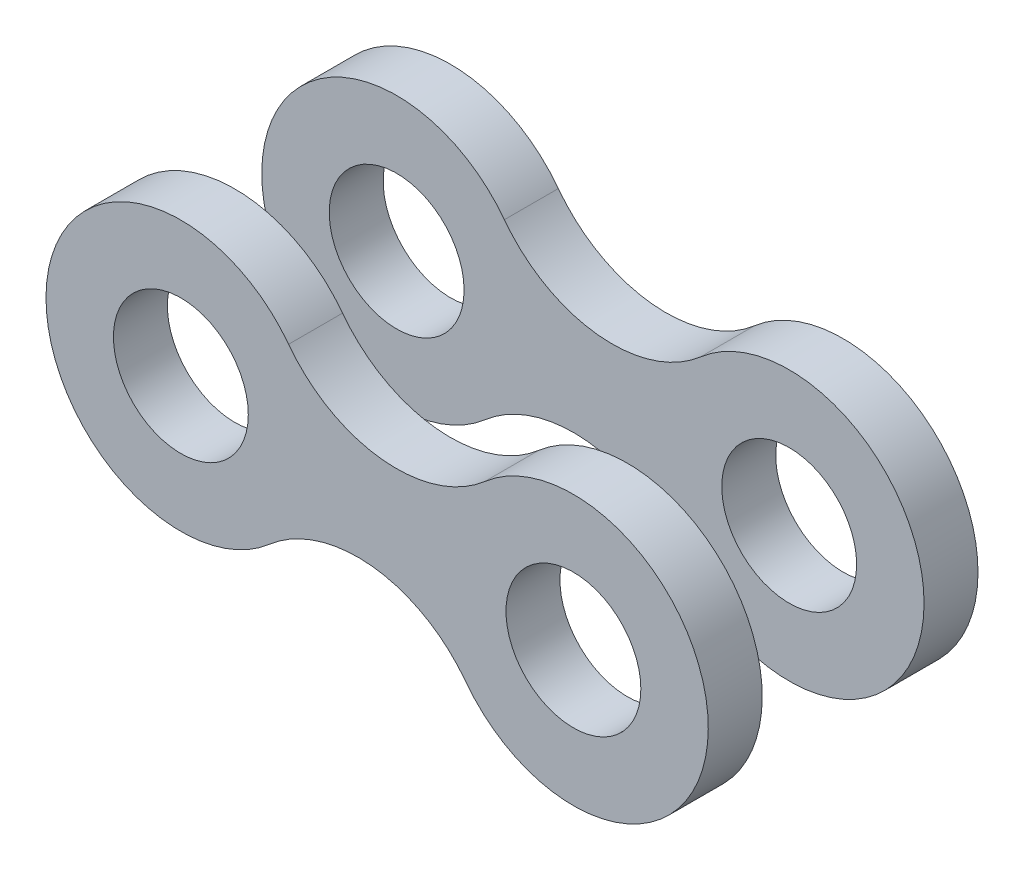
ISO-10303-21;
HEADER;
FILE_DESCRIPTION(('STEP AP214'),'2;1');
FILE_NAME('part.step','',(''),(''),'','','');
FILE_SCHEMA(('AUTOMOTIVE_DESIGN { 1 0 10303 214 1 1 1 1 }'));
ENDSEC;
DATA;
#1=APPLICATION_CONTEXT('core data for automotive mechanical design processes');
#2=APPLICATION_PROTOCOL_DEFINITION('international standard','automotive_design',2000,#1);
#3=PRODUCT_CONTEXT('',#1,'mechanical');
#4=PRODUCT('Part','Part','',(#3));
#5=PRODUCT_RELATED_PRODUCT_CATEGORY('part','',(#4));
#6=PRODUCT_DEFINITION_FORMATION('','',#4);
#7=PRODUCT_DEFINITION_CONTEXT('part definition',#1,'design');
#8=PRODUCT_DEFINITION('design','',#6,#7);
#9=PRODUCT_DEFINITION_SHAPE('','',#8);
#10=(LENGTH_UNIT() NAMED_UNIT(*) SI_UNIT(.MILLI.,.METRE.));
#11=(NAMED_UNIT(*) PLANE_ANGLE_UNIT() SI_UNIT($,.RADIAN.));
#12=(NAMED_UNIT(*) SI_UNIT($,.STERADIAN.) SOLID_ANGLE_UNIT());
#13=UNCERTAINTY_MEASURE_WITH_UNIT(LENGTH_MEASURE(1.E-05),#10,'distance_accuracy_value','');
#14=(GEOMETRIC_REPRESENTATION_CONTEXT(3) GLOBAL_UNCERTAINTY_ASSIGNED_CONTEXT((#13)) GLOBAL_UNIT_ASSIGNED_CONTEXT((#10,
#11,#12)) REPRESENTATION_CONTEXT('',''));
#15=CARTESIAN_POINT('',(0.,0.,0.));
#16=DIRECTION('',(0.,0.,1.));
#17=DIRECTION('',(1.,0.,0.));
#18=AXIS2_PLACEMENT_3D('',#15,#16,#17);
#19=CARTESIAN_POINT('',(7.98940405932851,76.0141019925456,-10.));
#20=DIRECTION('',(0.,0.,1.));
#21=DIRECTION('',(1.,0.,0.));
#22=AXIS2_PLACEMENT_3D('',#19,#20,#21);
#23=CYLINDRICAL_SURFACE('',#22,4.99999999999848);
#24=CARTESIAN_POINT('',(7.98940405932851,76.0141019925456,-8.));
#25=DIRECTION('',(0.,0.,-1.));
#26=DIRECTION('',(-1.,0.,0.));
#27=AXIS2_PLACEMENT_3D('',#24,#25,#26);
#28=CIRCLE('',#27,4.99999999999848);
#29=CARTESIAN_POINT('',(11.2716112082778,72.2422170219565,-8.));
#30=VERTEX_POINT('',#29);
#31=CARTESIAN_POINT('',(3.99470202966273,73.0070509962741,-8.));
#32=VERTEX_POINT('',#31);
#33=EDGE_CURVE('E116',#30,#32,#28,.T.);
#34=ORIENTED_EDGE('',*,*,#33,.F.);
#35=DIRECTION('',(0.,0.,1.));
#36=VECTOR('',#35,1.);
#37=CARTESIAN_POINT('',(11.2716112082778,72.2422170219565,-10.));
#38=LINE('',#37,#36);
#39=CARTESIAN_POINT('',(11.2716112082778,72.2422170219565,-10.));
#40=VERTEX_POINT('',#39);
#41=EDGE_CURVE('E12',#40,#30,#38,.T.);
#42=ORIENTED_EDGE('',*,*,#41,.F.);
#43=CARTESIAN_POINT('',(7.98940405932851,76.0141019925456,-10.));
#44=DIRECTION('',(0.,0.,-1.));
#45=DIRECTION('',(-1.,0.,0.));
#46=AXIS2_PLACEMENT_3D('',#43,#44,#45);
#47=CIRCLE('',#46,4.99999999999848);
#48=CARTESIAN_POINT('',(3.99470202966273,73.0070509962741,-10.));
#49=VERTEX_POINT('',#48);
#50=EDGE_CURVE('E109',#40,#49,#47,.T.);
#51=ORIENTED_EDGE('',*,*,#50,.T.);
#52=DIRECTION('',(0.,0.,1.));
#53=VECTOR('',#52,1.);
#54=CARTESIAN_POINT('',(3.99470202966273,73.0070509962741,-10.));
#55=LINE('',#54,#53);
#56=EDGE_CURVE('E54',#49,#32,#55,.T.);
#57=ORIENTED_EDGE('',*,*,#56,.T.);
#58=EDGE_LOOP('',(#34,#42,#51,#57));
#59=FACE_BOUND('',#58,.T.);
#60=ADVANCED_FACE('F51',(#59),#23,.F.);
#61=CARTESIAN_POINT('',(14.5538183572296,68.4703320513641,-10.));
#62=DIRECTION('',(0.,0.,1.));
#63=DIRECTION('',(1.,0.,0.));
#64=AXIS2_PLACEMENT_3D('',#61,#62,#63);
#65=CYLINDRICAL_SURFACE('',#64,5.00000000000123);
#66=CARTESIAN_POINT('',(14.5538183572296,68.4703320513641,-8.));
#67=DIRECTION('',(0.,0.,1.));
#68=DIRECTION('',(1.,0.,0.));
#69=AXIS2_PLACEMENT_3D('',#66,#67,#68);
#70=CIRCLE('',#69,5.00000000000123);
#71=CARTESIAN_POINT('',(10.5591163275639,65.4632810550894,-8.));
#72=VERTEX_POINT('',#71);
#73=EDGE_CURVE('E111',#72,#30,#70,.T.);
#74=ORIENTED_EDGE('',*,*,#73,.F.);
#75=DIRECTION('',(0.,0.,1.));
#76=VECTOR('',#75,1.);
#77=CARTESIAN_POINT('',(10.5591163275639,65.4632810550894,-10.));
#78=LINE('',#77,#76);
#79=CARTESIAN_POINT('',(10.5591163275639,65.4632810550894,-10.));
#80=VERTEX_POINT('',#79);
#81=EDGE_CURVE('E60',#80,#72,#78,.T.);
#82=ORIENTED_EDGE('',*,*,#81,.F.);
#83=CARTESIAN_POINT('',(14.5538183572296,68.4703320513641,-10.));
#84=DIRECTION('',(0.,0.,1.));
#85=DIRECTION('',(1.,0.,0.));
#86=AXIS2_PLACEMENT_3D('',#83,#84,#85);
#87=CIRCLE('',#86,5.00000000000123);
#88=EDGE_CURVE('E106',#80,#40,#87,.T.);
#89=ORIENTED_EDGE('',*,*,#88,.T.);
#90=ORIENTED_EDGE('',*,*,#41,.T.);
#91=EDGE_LOOP('',(#74,#82,#89,#90));
#92=FACE_BOUND('',#91,.T.);
#93=ADVANCED_FACE('F127',(#92),#65,.T.);
#94=CARTESIAN_POINT('',(6.56441429789912,62.4562300588154,-10.));
#95=DIRECTION('',(0.,0.,1.));
#96=DIRECTION('',(1.,0.,0.));
#97=AXIS2_PLACEMENT_3D('',#94,#95,#96);
#98=CYLINDRICAL_SURFACE('',#97,5.00000000000003);
#99=CARTESIAN_POINT('',(6.56441429789912,62.4562300588154,-8.));
#100=DIRECTION('',(0.,0.,-1.));
#101=DIRECTION('',(1.,0.,0.));
#102=AXIS2_PLACEMENT_3D('',#99,#100,#101);
#103=CIRCLE('',#102,5.00000000000003);
#104=CARTESIAN_POINT('',(3.28220714895012,66.2281150294088,-8.));
#105=VERTEX_POINT('',#104);
#106=EDGE_CURVE('E101',#105,#72,#103,.T.);
#107=ORIENTED_EDGE('',*,*,#106,.F.);
#108=DIRECTION('',(0.,0.,1.));
#109=VECTOR('',#108,1.);
#110=CARTESIAN_POINT('',(3.28220714895012,66.2281150294088,-10.));
#111=LINE('',#110,#109);
#112=CARTESIAN_POINT('',(3.28220714895012,66.2281150294088,-10.));
#113=VERTEX_POINT('',#112);
#114=EDGE_CURVE('E96',#113,#105,#111,.T.);
#115=ORIENTED_EDGE('',*,*,#114,.F.);
#116=CARTESIAN_POINT('',(6.56441429789912,62.4562300588154,-10.));
#117=DIRECTION('',(0.,0.,-1.));
#118=DIRECTION('',(1.,0.,0.));
#119=AXIS2_PLACEMENT_3D('',#116,#117,#118);
#120=CIRCLE('',#119,5.00000000000003);
#121=EDGE_CURVE('E99',#113,#80,#120,.T.);
#122=ORIENTED_EDGE('',*,*,#121,.T.);
#123=ORIENTED_EDGE('',*,*,#81,.T.);
#124=EDGE_LOOP('',(#107,#115,#122,#123));
#125=FACE_BOUND('',#124,.T.);
#126=ADVANCED_FACE('F98',(#125),#98,.F.);
#127=CARTESIAN_POINT('',(0.,70.,-10.));
#128=DIRECTION('',(0.,0.,1.));
#129=DIRECTION('',(1.,0.,0.));
#130=AXIS2_PLACEMENT_3D('',#127,#128,#129);
#131=CYLINDRICAL_SURFACE('',#130,4.99999999999843);
#132=CARTESIAN_POINT('',(0.,70.,-8.));
#133=DIRECTION('',(0.,0.,1.));
#134=DIRECTION('',(1.,0.,0.));
#135=AXIS2_PLACEMENT_3D('',#132,#133,#134);
#136=CIRCLE('',#135,4.99999999999843);
#137=EDGE_CURVE('E119',#32,#105,#136,.T.);
#138=ORIENTED_EDGE('',*,*,#137,.F.);
#139=ORIENTED_EDGE('',*,*,#56,.F.);
#140=CARTESIAN_POINT('',(0.,70.,-10.));
#141=DIRECTION('',(0.,0.,1.));
#142=DIRECTION('',(1.,0.,0.));
#143=AXIS2_PLACEMENT_3D('',#140,#141,#142);
#144=CIRCLE('',#143,4.99999999999843);
#145=EDGE_CURVE('E105',#49,#113,#144,.T.);
#146=ORIENTED_EDGE('',*,*,#145,.T.);
#147=ORIENTED_EDGE('',*,*,#114,.T.);
#148=EDGE_LOOP('',(#138,#139,#146,#147));
#149=FACE_BOUND('',#148,.T.);
#150=ADVANCED_FACE('F108',(#149),#131,.T.);
#151=CARTESIAN_POINT('',(3.99470202966425,73.0070509962728,-10.));
#152=DIRECTION('',(0.,0.,-1.));
#153=DIRECTION('',(-1.,0.,0.));
#154=AXIS2_PLACEMENT_3D('',#151,#152,#153);
#155=PLANE('',#154);
#156=CARTESIAN_POINT('',(14.5538183572296,68.4703320513641,-10.));
#157=DIRECTION('',(0.,0.,1.));
#158=DIRECTION('',(1.,0.,0.));
#159=AXIS2_PLACEMENT_3D('',#156,#157,#158);
#160=CIRCLE('',#159,2.50000000001364);
#161=CARTESIAN_POINT('',(17.0538183572433,68.4703320513641,-10.));
#162=VERTEX_POINT('',#161);
#163=EDGE_CURVE('E160',#162,#162,#160,.T.);
#164=ORIENTED_EDGE('',*,*,#163,.T.);
#165=EDGE_LOOP('',(#164));
#166=FACE_BOUND('',#165,.T.);
#167=CARTESIAN_POINT('',(0.,70.,-10.));
#168=DIRECTION('',(0.,0.,1.));
#169=DIRECTION('',(1.,0.,0.));
#170=AXIS2_PLACEMENT_3D('',#167,#168,#169);
#171=CIRCLE('',#170,2.50000000000001);
#172=CARTESIAN_POINT('',(2.50000000000001,70.,-10.));
#173=VERTEX_POINT('',#172);
#174=EDGE_CURVE('E120',#173,#173,#171,.T.);
#175=ORIENTED_EDGE('',*,*,#174,.T.);
#176=EDGE_LOOP('',(#175));
#177=FACE_BOUND('',#176,.T.);
#178=ORIENTED_EDGE('',*,*,#50,.F.);
#179=ORIENTED_EDGE('',*,*,#88,.F.);
#180=ORIENTED_EDGE('',*,*,#121,.F.);
#181=ORIENTED_EDGE('',*,*,#145,.F.);
#182=EDGE_LOOP('',(#178,#179,#180,#181));
#183=FACE_BOUND('',#182,.T.);
#184=ADVANCED_FACE('F104',(#166,#177,#183),#155,.T.);
#185=CARTESIAN_POINT('',(3.99470202966425,73.0070509962728,-8.));
#186=DIRECTION('',(0.,0.,-1.));
#187=DIRECTION('',(-1.,0.,0.));
#188=AXIS2_PLACEMENT_3D('',#185,#186,#187);
#189=PLANE('',#188);
#190=CARTESIAN_POINT('',(14.5538183572296,68.4703320513641,-8.));
#191=DIRECTION('',(0.,0.,1.));
#192=DIRECTION('',(1.,0.,0.));
#193=AXIS2_PLACEMENT_3D('',#190,#191,#192);
#194=CIRCLE('',#193,2.50000000001364);
#195=CARTESIAN_POINT('',(17.0538183572433,68.4703320513641,-8.));
#196=VERTEX_POINT('',#195);
#197=EDGE_CURVE('E163',#196,#196,#194,.T.);
#198=ORIENTED_EDGE('',*,*,#197,.F.);
#199=EDGE_LOOP('',(#198));
#200=FACE_BOUND('',#199,.T.);
#201=CARTESIAN_POINT('',(0.,70.,-8.));
#202=DIRECTION('',(0.,0.,1.));
#203=DIRECTION('',(1.,0.,0.));
#204=AXIS2_PLACEMENT_3D('',#201,#202,#203);
#205=CIRCLE('',#204,2.50000000000001);
#206=CARTESIAN_POINT('',(2.50000000000001,70.,-8.));
#207=VERTEX_POINT('',#206);
#208=EDGE_CURVE('E165',#207,#207,#205,.T.);
#209=ORIENTED_EDGE('',*,*,#208,.F.);
#210=EDGE_LOOP('',(#209));
#211=FACE_BOUND('',#210,.T.);
#212=ORIENTED_EDGE('',*,*,#33,.T.);
#213=ORIENTED_EDGE('',*,*,#137,.T.);
#214=ORIENTED_EDGE('',*,*,#106,.T.);
#215=ORIENTED_EDGE('',*,*,#73,.T.);
#216=EDGE_LOOP('',(#212,#213,#214,#215));
#217=FACE_BOUND('',#216,.T.);
#218=ADVANCED_FACE('F126',(#200,#211,#217),#189,.F.);
#219=CARTESIAN_POINT('',(0.,70.,-10.));
#220=DIRECTION('',(0.,0.,1.));
#221=DIRECTION('',(1.,0.,0.));
#222=AXIS2_PLACEMENT_3D('',#219,#220,#221);
#223=CYLINDRICAL_SURFACE('',#222,2.50000000000001);
#224=ORIENTED_EDGE('',*,*,#174,.F.);
#225=EDGE_LOOP('',(#224));
#226=FACE_BOUND('',#225,.T.);
#227=ORIENTED_EDGE('',*,*,#208,.T.);
#228=EDGE_LOOP('',(#227));
#229=FACE_BOUND('',#228,.T.);
#230=ADVANCED_FACE('F145',(#226,#229),#223,.F.);
#231=CARTESIAN_POINT('',(14.5538183572296,68.4703320513641,-10.));
#232=DIRECTION('',(0.,0.,1.));
#233=DIRECTION('',(1.,0.,0.));
#234=AXIS2_PLACEMENT_3D('',#231,#232,#233);
#235=CYLINDRICAL_SURFACE('',#234,2.50000000001364);
#236=ORIENTED_EDGE('',*,*,#163,.F.);
#237=EDGE_LOOP('',(#236));
#238=FACE_BOUND('',#237,.T.);
#239=ORIENTED_EDGE('',*,*,#197,.T.);
#240=EDGE_LOOP('',(#239));
#241=FACE_BOUND('',#240,.T.);
#242=ADVANCED_FACE('F152',(#238,#241),#235,.F.);
#243=CLOSED_SHELL('',(#60,#93,#126,#150,#184,#218,#230,#242));
#244=MANIFOLD_SOLID_BREP('B2',#243);
#245=CARTESIAN_POINT('',(7.98940405932851,76.0141019925456,-2.));
#246=DIRECTION('',(0.,0.,1.));
#247=DIRECTION('',(1.,0.,0.));
#248=AXIS2_PLACEMENT_3D('',#245,#246,#247);
#249=CYLINDRICAL_SURFACE('',#248,4.99999999999848);
#250=CARTESIAN_POINT('',(7.98940405932851,76.0141019925456,0.));
#251=DIRECTION('',(0.,0.,-1.));
#252=DIRECTION('',(-1.,0.,0.));
#253=AXIS2_PLACEMENT_3D('',#250,#251,#252);
#254=CIRCLE('',#253,4.99999999999848);
#255=CARTESIAN_POINT('',(11.2716112082778,72.2422170219565,0.));
#256=VERTEX_POINT('',#255);
#257=CARTESIAN_POINT('',(3.99470202966273,73.0070509962741,0.));
#258=VERTEX_POINT('',#257);
#259=EDGE_CURVE('E282',#256,#258,#254,.T.);
#260=ORIENTED_EDGE('',*,*,#259,.F.);
#261=DIRECTION('',(0.,0.,1.));
#262=VECTOR('',#261,1.);
#263=CARTESIAN_POINT('',(11.2716112082778,72.2422170219565,-2.));
#264=LINE('',#263,#262);
#265=CARTESIAN_POINT('',(11.2716112082778,72.2422170219565,-2.));
#266=VERTEX_POINT('',#265);
#267=EDGE_CURVE('E49',#266,#256,#264,.T.);
#268=ORIENTED_EDGE('',*,*,#267,.F.);
#269=CARTESIAN_POINT('',(7.98940405932851,76.0141019925456,-2.));
#270=DIRECTION('',(0.,0.,-1.));
#271=DIRECTION('',(-1.,0.,0.));
#272=AXIS2_PLACEMENT_3D('',#269,#270,#271);
#273=CIRCLE('',#272,4.99999999999848);
#274=CARTESIAN_POINT('',(3.99470202966273,73.0070509962741,-2.));
#275=VERTEX_POINT('',#274);
#276=EDGE_CURVE('E275',#266,#275,#273,.T.);
#277=ORIENTED_EDGE('',*,*,#276,.T.);
#278=DIRECTION('',(0.,0.,1.));
#279=VECTOR('',#278,1.);
#280=CARTESIAN_POINT('',(3.99470202966273,73.0070509962741,-2.));
#281=LINE('',#280,#279);
#282=EDGE_CURVE('E220',#275,#258,#281,.T.);
#283=ORIENTED_EDGE('',*,*,#282,.T.);
#284=EDGE_LOOP('',(#260,#268,#277,#283));
#285=FACE_BOUND('',#284,.T.);
#286=ADVANCED_FACE('F217',(#285),#249,.F.);
#287=CARTESIAN_POINT('',(14.5538183572296,68.4703320513641,-2.));
#288=DIRECTION('',(0.,0.,1.));
#289=DIRECTION('',(1.,0.,0.));
#290=AXIS2_PLACEMENT_3D('',#287,#288,#289);
#291=CYLINDRICAL_SURFACE('',#290,5.00000000000123);
#292=CARTESIAN_POINT('',(14.5538183572296,68.4703320513641,0.));
#293=DIRECTION('',(0.,0.,1.));
#294=DIRECTION('',(1.,0.,0.));
#295=AXIS2_PLACEMENT_3D('',#292,#293,#294);
#296=CIRCLE('',#295,5.00000000000123);
#297=CARTESIAN_POINT('',(10.5591163275639,65.4632810550894,0.));
#298=VERTEX_POINT('',#297);
#299=EDGE_CURVE('E277',#298,#256,#296,.T.);
#300=ORIENTED_EDGE('',*,*,#299,.F.);
#301=DIRECTION('',(0.,0.,1.));
#302=VECTOR('',#301,1.);
#303=CARTESIAN_POINT('',(10.5591163275639,65.4632810550894,-2.));
#304=LINE('',#303,#302);
#305=CARTESIAN_POINT('',(10.5591163275639,65.4632810550894,-2.));
#306=VERTEX_POINT('',#305);
#307=EDGE_CURVE('E226',#306,#298,#304,.T.);
#308=ORIENTED_EDGE('',*,*,#307,.F.);
#309=CARTESIAN_POINT('',(14.5538183572296,68.4703320513641,-2.));
#310=DIRECTION('',(0.,0.,1.));
#311=DIRECTION('',(1.,0.,0.));
#312=AXIS2_PLACEMENT_3D('',#309,#310,#311);
#313=CIRCLE('',#312,5.00000000000123);
#314=EDGE_CURVE('E272',#306,#266,#313,.T.);
#315=ORIENTED_EDGE('',*,*,#314,.T.);
#316=ORIENTED_EDGE('',*,*,#267,.T.);
#317=EDGE_LOOP('',(#300,#308,#315,#316));
#318=FACE_BOUND('',#317,.T.);
#319=ADVANCED_FACE('F293',(#318),#291,.T.);
#320=CARTESIAN_POINT('',(6.56441429789912,62.4562300588154,-2.));
#321=DIRECTION('',(0.,0.,1.));
#322=DIRECTION('',(1.,0.,0.));
#323=AXIS2_PLACEMENT_3D('',#320,#321,#322);
#324=CYLINDRICAL_SURFACE('',#323,5.00000000000003);
#325=CARTESIAN_POINT('',(6.56441429789912,62.4562300588154,0.));
#326=DIRECTION('',(0.,0.,-1.));
#327=DIRECTION('',(1.,0.,0.));
#328=AXIS2_PLACEMENT_3D('',#325,#326,#327);
#329=CIRCLE('',#328,5.00000000000003);
#330=CARTESIAN_POINT('',(3.28220714895012,66.2281150294088,0.));
#331=VERTEX_POINT('',#330);
#332=EDGE_CURVE('E267',#331,#298,#329,.T.);
#333=ORIENTED_EDGE('',*,*,#332,.F.);
#334=DIRECTION('',(0.,0.,1.));
#335=VECTOR('',#334,1.);
#336=CARTESIAN_POINT('',(3.28220714895012,66.2281150294088,-2.));
#337=LINE('',#336,#335);
#338=CARTESIAN_POINT('',(3.28220714895012,66.2281150294088,-2.));
#339=VERTEX_POINT('',#338);
#340=EDGE_CURVE('E262',#339,#331,#337,.T.);
#341=ORIENTED_EDGE('',*,*,#340,.F.);
#342=CARTESIAN_POINT('',(6.56441429789912,62.4562300588154,-2.));
#343=DIRECTION('',(0.,0.,-1.));
#344=DIRECTION('',(1.,0.,0.));
#345=AXIS2_PLACEMENT_3D('',#342,#343,#344);
#346=CIRCLE('',#345,5.00000000000003);
#347=EDGE_CURVE('E265',#339,#306,#346,.T.);
#348=ORIENTED_EDGE('',*,*,#347,.T.);
#349=ORIENTED_EDGE('',*,*,#307,.T.);
#350=EDGE_LOOP('',(#333,#341,#348,#349));
#351=FACE_BOUND('',#350,.T.);
#352=ADVANCED_FACE('F264',(#351),#324,.F.);
#353=CARTESIAN_POINT('',(0.,70.,-2.));
#354=DIRECTION('',(0.,0.,1.));
#355=DIRECTION('',(1.,0.,0.));
#356=AXIS2_PLACEMENT_3D('',#353,#354,#355);
#357=CYLINDRICAL_SURFACE('',#356,4.99999999999843);
#358=CARTESIAN_POINT('',(0.,70.,0.));
#359=DIRECTION('',(0.,0.,1.));
#360=DIRECTION('',(1.,0.,0.));
#361=AXIS2_PLACEMENT_3D('',#358,#359,#360);
#362=CIRCLE('',#361,4.99999999999843);
#363=EDGE_CURVE('E285',#258,#331,#362,.T.);
#364=ORIENTED_EDGE('',*,*,#363,.F.);
#365=ORIENTED_EDGE('',*,*,#282,.F.);
#366=CARTESIAN_POINT('',(0.,70.,-2.));
#367=DIRECTION('',(0.,0.,1.));
#368=DIRECTION('',(1.,0.,0.));
#369=AXIS2_PLACEMENT_3D('',#366,#367,#368);
#370=CIRCLE('',#369,4.99999999999843);
#371=EDGE_CURVE('E271',#275,#339,#370,.T.);
#372=ORIENTED_EDGE('',*,*,#371,.T.);
#373=ORIENTED_EDGE('',*,*,#340,.T.);
#374=EDGE_LOOP('',(#364,#365,#372,#373));
#375=FACE_BOUND('',#374,.T.);
#376=ADVANCED_FACE('F274',(#375),#357,.T.);
#377=CARTESIAN_POINT('',(3.99470202966425,73.0070509962728,-2.));
#378=DIRECTION('',(0.,0.,-1.));
#379=DIRECTION('',(-1.,0.,0.));
#380=AXIS2_PLACEMENT_3D('',#377,#378,#379);
#381=PLANE('',#380);
#382=CARTESIAN_POINT('',(14.5538183572296,68.4703320513641,-2.));
#383=DIRECTION('',(0.,0.,1.));
#384=DIRECTION('',(1.,0.,0.));
#385=AXIS2_PLACEMENT_3D('',#382,#383,#384);
#386=CIRCLE('',#385,2.50000000001364);
#387=CARTESIAN_POINT('',(17.0538183572433,68.4703320513641,-2.));
#388=VERTEX_POINT('',#387);
#389=EDGE_CURVE('E326',#388,#388,#386,.T.);
#390=ORIENTED_EDGE('',*,*,#389,.T.);
#391=EDGE_LOOP('',(#390));
#392=FACE_BOUND('',#391,.T.);
#393=CARTESIAN_POINT('',(0.,70.,-2.));
#394=DIRECTION('',(0.,0.,1.));
#395=DIRECTION('',(1.,0.,0.));
#396=AXIS2_PLACEMENT_3D('',#393,#394,#395);
#397=CIRCLE('',#396,2.50000000000001);
#398=CARTESIAN_POINT('',(2.50000000000001,70.,-2.));
#399=VERTEX_POINT('',#398);
#400=EDGE_CURVE('E286',#399,#399,#397,.T.);
#401=ORIENTED_EDGE('',*,*,#400,.T.);
#402=EDGE_LOOP('',(#401));
#403=FACE_BOUND('',#402,.T.);
#404=ORIENTED_EDGE('',*,*,#276,.F.);
#405=ORIENTED_EDGE('',*,*,#314,.F.);
#406=ORIENTED_EDGE('',*,*,#347,.F.);
#407=ORIENTED_EDGE('',*,*,#371,.F.);
#408=EDGE_LOOP('',(#404,#405,#406,#407));
#409=FACE_BOUND('',#408,.T.);
#410=ADVANCED_FACE('F270',(#392,#403,#409),#381,.T.);
#411=CARTESIAN_POINT('',(3.99470202966425,73.0070509962728,0.));
#412=DIRECTION('',(0.,0.,-1.));
#413=DIRECTION('',(-1.,0.,0.));
#414=AXIS2_PLACEMENT_3D('',#411,#412,#413);
#415=PLANE('',#414);
#416=CARTESIAN_POINT('',(14.5538183572296,68.4703320513641,0.));
#417=DIRECTION('',(0.,0.,1.));
#418=DIRECTION('',(1.,0.,0.));
#419=AXIS2_PLACEMENT_3D('',#416,#417,#418);
#420=CIRCLE('',#419,2.50000000001364);
#421=CARTESIAN_POINT('',(17.0538183572433,68.4703320513641,0.));
#422=VERTEX_POINT('',#421);
#423=EDGE_CURVE('E329',#422,#422,#420,.T.);
#424=ORIENTED_EDGE('',*,*,#423,.F.);
#425=EDGE_LOOP('',(#424));
#426=FACE_BOUND('',#425,.T.);
#427=CARTESIAN_POINT('',(0.,70.,0.));
#428=DIRECTION('',(0.,0.,1.));
#429=DIRECTION('',(1.,0.,0.));
#430=AXIS2_PLACEMENT_3D('',#427,#428,#429);
#431=CIRCLE('',#430,2.50000000000001);
#432=CARTESIAN_POINT('',(2.50000000000001,70.,0.));
#433=VERTEX_POINT('',#432);
#434=EDGE_CURVE('E331',#433,#433,#431,.T.);
#435=ORIENTED_EDGE('',*,*,#434,.F.);
#436=EDGE_LOOP('',(#435));
#437=FACE_BOUND('',#436,.T.);
#438=ORIENTED_EDGE('',*,*,#259,.T.);
#439=ORIENTED_EDGE('',*,*,#363,.T.);
#440=ORIENTED_EDGE('',*,*,#332,.T.);
#441=ORIENTED_EDGE('',*,*,#299,.T.);
#442=EDGE_LOOP('',(#438,#439,#440,#441));
#443=FACE_BOUND('',#442,.T.);
#444=ADVANCED_FACE('F292',(#426,#437,#443),#415,.F.);
#445=CARTESIAN_POINT('',(0.,70.,-2.));
#446=DIRECTION('',(0.,0.,1.));
#447=DIRECTION('',(1.,0.,0.));
#448=AXIS2_PLACEMENT_3D('',#445,#446,#447);
#449=CYLINDRICAL_SURFACE('',#448,2.50000000000001);
#450=ORIENTED_EDGE('',*,*,#400,.F.);
#451=EDGE_LOOP('',(#450));
#452=FACE_BOUND('',#451,.T.);
#453=ORIENTED_EDGE('',*,*,#434,.T.);
#454=EDGE_LOOP('',(#453));
#455=FACE_BOUND('',#454,.T.);
#456=ADVANCED_FACE('F311',(#452,#455),#449,.F.);
#457=CARTESIAN_POINT('',(14.5538183572296,68.4703320513641,-2.));
#458=DIRECTION('',(0.,0.,1.));
#459=DIRECTION('',(1.,0.,0.));
#460=AXIS2_PLACEMENT_3D('',#457,#458,#459);
#461=CYLINDRICAL_SURFACE('',#460,2.50000000001364);
#462=ORIENTED_EDGE('',*,*,#389,.F.);
#463=EDGE_LOOP('',(#462));
#464=FACE_BOUND('',#463,.T.);
#465=ORIENTED_EDGE('',*,*,#423,.T.);
#466=EDGE_LOOP('',(#465));
#467=FACE_BOUND('',#466,.T.);
#468=ADVANCED_FACE('F318',(#464,#467),#461,.F.);
#469=CLOSED_SHELL('',(#286,#319,#352,#376,#410,#444,#456,#468));
#470=MANIFOLD_SOLID_BREP('B6',#469);
#471=ADVANCED_BREP_SHAPE_REPRESENTATION('',(#18,#244,#470),#14);
#472=SHAPE_DEFINITION_REPRESENTATION(#9,#471);
ENDSEC;
END-ISO-10303-21;
